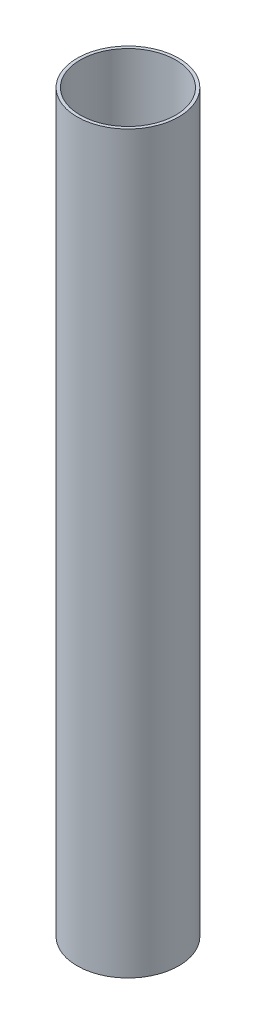
ISO-10303-21;
HEADER;
FILE_DESCRIPTION(('STEP AP214'),'2;1');
FILE_NAME('part.step','',(''),(''),'','','');
FILE_SCHEMA(('AUTOMOTIVE_DESIGN { 1 0 10303 214 1 1 1 1 }'));
ENDSEC;
DATA;
#1=APPLICATION_CONTEXT('core data for automotive mechanical design processes');
#2=APPLICATION_PROTOCOL_DEFINITION('international standard','automotive_design',2000,#1);
#3=PRODUCT_CONTEXT('',#1,'mechanical');
#4=PRODUCT('Part','Part','',(#3));
#5=PRODUCT_RELATED_PRODUCT_CATEGORY('part','',(#4));
#6=PRODUCT_DEFINITION_FORMATION('','',#4);
#7=PRODUCT_DEFINITION_CONTEXT('part definition',#1,'design');
#8=PRODUCT_DEFINITION('design','',#6,#7);
#9=PRODUCT_DEFINITION_SHAPE('','',#8);
#10=(LENGTH_UNIT() NAMED_UNIT(*) SI_UNIT(.MILLI.,.METRE.));
#11=(NAMED_UNIT(*) PLANE_ANGLE_UNIT() SI_UNIT($,.RADIAN.));
#12=(NAMED_UNIT(*) SI_UNIT($,.STERADIAN.) SOLID_ANGLE_UNIT());
#13=UNCERTAINTY_MEASURE_WITH_UNIT(LENGTH_MEASURE(1.E-05),#10,'distance_accuracy_value','');
#14=(GEOMETRIC_REPRESENTATION_CONTEXT(3) GLOBAL_UNCERTAINTY_ASSIGNED_CONTEXT((#13)) GLOBAL_UNIT_ASSIGNED_CONTEXT((#10,
#11,#12)) REPRESENTATION_CONTEXT('',''));
#15=CARTESIAN_POINT('',(0.,0.,0.));
#16=DIRECTION('',(0.,0.,1.));
#17=DIRECTION('',(1.,0.,0.));
#18=AXIS2_PLACEMENT_3D('',#15,#16,#17);
#19=CARTESIAN_POINT('',(0.,1146.81,0.));
#20=DIRECTION('',(0.,1.,0.));
#21=DIRECTION('',(0.,0.,1.));
#22=AXIS2_PLACEMENT_3D('',#19,#20,#21);
#23=CYLINDRICAL_SURFACE('',#22,49.53);
#24=CARTESIAN_POINT('',(0.,0.,0.));
#25=DIRECTION('',(0.,1.,0.));
#26=DIRECTION('',(0.,0.,1.));
#27=AXIS2_PLACEMENT_3D('',#24,#25,#26);
#28=CIRCLE('',#27,49.53);
#29=CARTESIAN_POINT('',(0.,0.,49.53));
#30=VERTEX_POINT('',#29);
#31=EDGE_CURVE('E10',#30,#30,#28,.T.);
#32=ORIENTED_EDGE('',*,*,#31,.F.);
#33=EDGE_LOOP('',(#32));
#34=FACE_BOUND('',#33,.T.);
#35=CARTESIAN_POINT('',(0.,762.,0.));
#36=DIRECTION('',(0.,1.,0.));
#37=DIRECTION('',(0.,0.,1.));
#38=AXIS2_PLACEMENT_3D('',#35,#36,#37);
#39=CIRCLE('',#38,49.5299999999999);
#40=CARTESIAN_POINT('',(0.,762.,49.5299999999999));
#41=VERTEX_POINT('',#40);
#42=EDGE_CURVE('E50',#41,#41,#39,.T.);
#43=ORIENTED_EDGE('',*,*,#42,.T.);
#44=EDGE_LOOP('',(#43));
#45=FACE_BOUND('',#44,.T.);
#46=ADVANCED_FACE('F36',(#34,#45),#23,.F.);
#47=CARTESIAN_POINT('',(49.53,0.,0.));
#48=DIRECTION('',(0.,1.,0.));
#49=DIRECTION('',(0.,0.,1.));
#50=AXIS2_PLACEMENT_3D('',#47,#48,#49);
#51=PLANE('',#50);
#52=CARTESIAN_POINT('',(0.,0.,0.));
#53=DIRECTION('',(0.,1.,0.));
#54=DIRECTION('',(0.,0.,1.));
#55=AXIS2_PLACEMENT_3D('',#52,#53,#54);
#56=CIRCLE('',#55,52.705);
#57=CARTESIAN_POINT('',(0.,0.,52.705));
#58=VERTEX_POINT('',#57);
#59=EDGE_CURVE('E42',#58,#58,#56,.T.);
#60=ORIENTED_EDGE('',*,*,#59,.F.);
#61=EDGE_LOOP('',(#60));
#62=FACE_BOUND('',#61,.T.);
#63=ORIENTED_EDGE('',*,*,#31,.T.);
#64=EDGE_LOOP('',(#63));
#65=FACE_BOUND('',#64,.T.);
#66=ADVANCED_FACE('F65',(#62,#65),#51,.F.);
#67=CARTESIAN_POINT('',(0.,1146.81,0.));
#68=DIRECTION('',(0.,1.,0.));
#69=DIRECTION('',(0.,0.,1.));
#70=AXIS2_PLACEMENT_3D('',#67,#68,#69);
#71=CYLINDRICAL_SURFACE('',#70,52.7049999999999);
#72=CARTESIAN_POINT('',(0.,762.,0.));
#73=DIRECTION('',(0.,1.,0.));
#74=DIRECTION('',(0.,0.,1.));
#75=AXIS2_PLACEMENT_3D('',#72,#73,#74);
#76=CIRCLE('',#75,52.7049999999999);
#77=CARTESIAN_POINT('',(0.,762.,52.7049999999999));
#78=VERTEX_POINT('',#77);
#79=EDGE_CURVE('E46',#78,#78,#76,.T.);
#80=ORIENTED_EDGE('',*,*,#79,.F.);
#81=EDGE_LOOP('',(#80));
#82=FACE_BOUND('',#81,.T.);
#83=ORIENTED_EDGE('',*,*,#59,.T.);
#84=EDGE_LOOP('',(#83));
#85=FACE_BOUND('',#84,.T.);
#86=ADVANCED_FACE('F60',(#82,#85),#71,.T.);
#87=CARTESIAN_POINT('',(49.5299999999999,762.,0.));
#88=DIRECTION('',(0.,-1.,0.));
#89=DIRECTION('',(0.,0.,-1.));
#90=AXIS2_PLACEMENT_3D('',#87,#88,#89);
#91=PLANE('',#90);
#92=ORIENTED_EDGE('',*,*,#42,.F.);
#93=EDGE_LOOP('',(#92));
#94=FACE_BOUND('',#93,.T.);
#95=ORIENTED_EDGE('',*,*,#79,.T.);
#96=EDGE_LOOP('',(#95));
#97=FACE_BOUND('',#96,.T.);
#98=ADVANCED_FACE('F57',(#94,#97),#91,.F.);
#99=CLOSED_SHELL('',(#46,#66,#86,#98));
#100=MANIFOLD_SOLID_BREP('B2',#99);
#101=ADVANCED_BREP_SHAPE_REPRESENTATION('',(#18,#100),#14);
#102=SHAPE_DEFINITION_REPRESENTATION(#9,#101);
ENDSEC;
END-ISO-10303-21;
